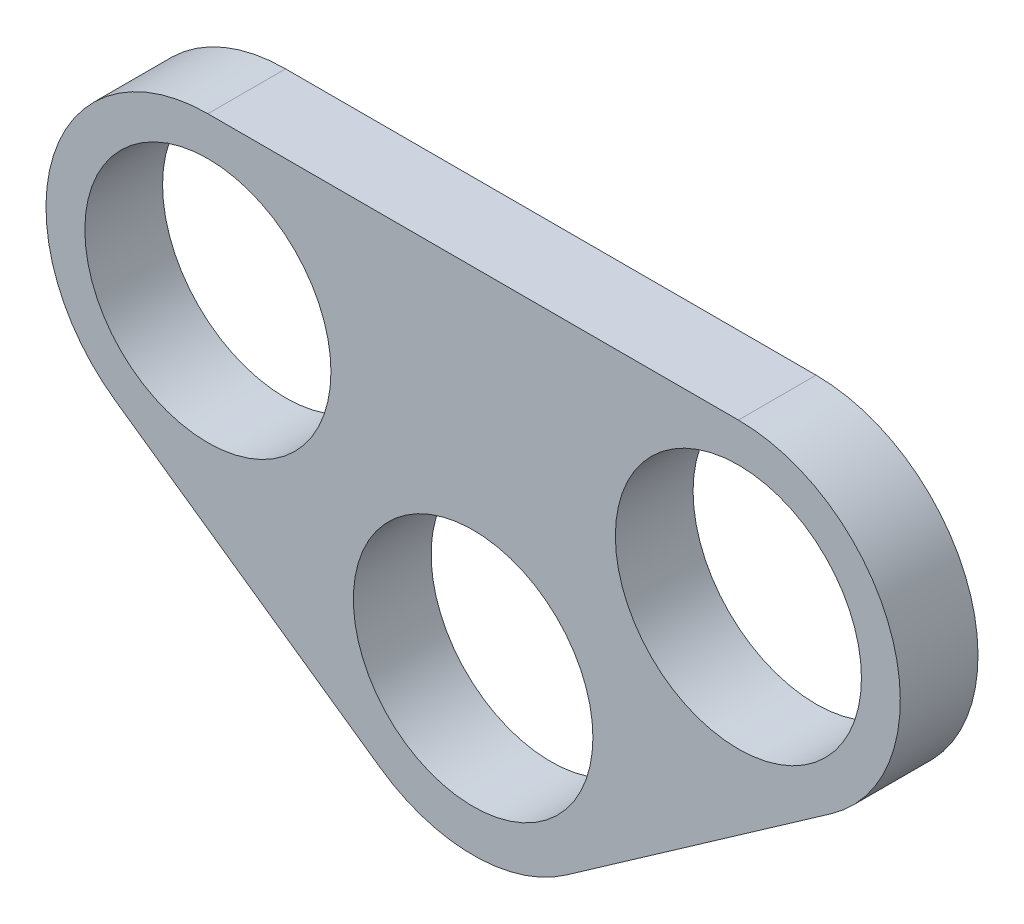
ISO-10303-21;
HEADER;
FILE_DESCRIPTION(('STEP AP214'),'2;1');
FILE_NAME('part.step','',(''),(''),'','','');
FILE_SCHEMA(('AUTOMOTIVE_DESIGN { 1 0 10303 214 1 1 1 1 }'));
ENDSEC;
DATA;
#1=APPLICATION_CONTEXT('core data for automotive mechanical design processes');
#2=APPLICATION_PROTOCOL_DEFINITION('international standard','automotive_design',2000,#1);
#3=PRODUCT_CONTEXT('',#1,'mechanical');
#4=PRODUCT('Part','Part','',(#3));
#5=PRODUCT_RELATED_PRODUCT_CATEGORY('part','',(#4));
#6=PRODUCT_DEFINITION_FORMATION('','',#4);
#7=PRODUCT_DEFINITION_CONTEXT('part definition',#1,'design');
#8=PRODUCT_DEFINITION('design','',#6,#7);
#9=PRODUCT_DEFINITION_SHAPE('','',#8);
#10=(LENGTH_UNIT() NAMED_UNIT(*) SI_UNIT(.MILLI.,.METRE.));
#11=(NAMED_UNIT(*) PLANE_ANGLE_UNIT() SI_UNIT($,.RADIAN.));
#12=(NAMED_UNIT(*) SI_UNIT($,.STERADIAN.) SOLID_ANGLE_UNIT());
#13=UNCERTAINTY_MEASURE_WITH_UNIT(LENGTH_MEASURE(1.E-05),#10,'distance_accuracy_value','');
#14=(GEOMETRIC_REPRESENTATION_CONTEXT(3) GLOBAL_UNCERTAINTY_ASSIGNED_CONTEXT((#13)) GLOBAL_UNIT_ASSIGNED_CONTEXT((#10,
#11,#12)) REPRESENTATION_CONTEXT('',''));
#15=CARTESIAN_POINT('',(0.,0.,0.));
#16=DIRECTION('',(0.,0.,1.));
#17=DIRECTION('',(1.,0.,0.));
#18=AXIS2_PLACEMENT_3D('',#15,#16,#17);
#19=CARTESIAN_POINT('',(7.16970545438809,-10.2394005536124,6.));
#20=DIRECTION('',(-0.573576436351047,0.819152044288991,0.));
#21=DIRECTION('',(-0.819152044288991,-0.573576436351047,0.));
#22=AXIS2_PLACEMENT_3D('',#19,#20,#21);
#23=PLANE('',#22);
#24=DIRECTION('',(0.819152044288991,0.573576436351047,0.));
#25=VECTOR('',#24,1.);
#26=CARTESIAN_POINT('',(7.16970545438809,-10.2394005536124,0.));
#27=LINE('',#26,#25);
#28=CARTESIAN_POINT('',(7.16970545438809,-10.2394005536124,0.));
#29=VERTEX_POINT('',#28);
#30=CARTESIAN_POINT('',(27.6485065616129,4.10001035516379,0.));
#31=VERTEX_POINT('',#30);
#32=EDGE_CURVE('E128',#29,#31,#27,.T.);
#33=ORIENTED_EDGE('',*,*,#32,.T.);
#34=DIRECTION('',(0.,0.,-1.));
#35=VECTOR('',#34,1.);
#36=CARTESIAN_POINT('',(27.6485065616129,4.10001035516379,6.));
#37=LINE('',#36,#35);
#38=CARTESIAN_POINT('',(27.6485065616129,4.10001035516379,6.));
#39=VERTEX_POINT('',#38);
#40=EDGE_CURVE('E11',#39,#31,#37,.T.);
#41=ORIENTED_EDGE('',*,*,#40,.F.);
#42=DIRECTION('',(0.819152044288991,0.573576436351047,0.));
#43=VECTOR('',#42,1.);
#44=CARTESIAN_POINT('',(7.16970545438809,-10.2394005536124,6.));
#45=LINE('',#44,#43);
#46=CARTESIAN_POINT('',(7.16970545438809,-10.2394005536124,6.));
#47=VERTEX_POINT('',#46);
#48=EDGE_CURVE('E149',#47,#39,#45,.T.);
#49=ORIENTED_EDGE('',*,*,#48,.F.);
#50=DIRECTION('',(0.,0.,-1.));
#51=VECTOR('',#50,1.);
#52=CARTESIAN_POINT('',(7.16970545438809,-10.2394005536124,6.));
#53=LINE('',#52,#51);
#54=EDGE_CURVE('E127',#47,#29,#53,.T.);
#55=ORIENTED_EDGE('',*,*,#54,.T.);
#56=EDGE_LOOP('',(#33,#41,#49,#55));
#57=FACE_BOUND('',#56,.T.);
#58=ADVANCED_FACE('F35',(#57),#23,.F.);
#59=CARTESIAN_POINT('',(20.4788011072248,14.3394109087762,6.));
#60=DIRECTION('',(0.,0.,-1.));
#61=DIRECTION('',(-1.,0.,0.));
#62=AXIS2_PLACEMENT_3D('',#59,#60,#61);
#63=CYLINDRICAL_SURFACE('',#62,12.5);
#64=CARTESIAN_POINT('',(20.4788011072248,14.3394109087762,0.));
#65=DIRECTION('',(0.,0.,1.));
#66=DIRECTION('',(1.,0.,0.));
#67=AXIS2_PLACEMENT_3D('',#64,#65,#66);
#68=CIRCLE('',#67,12.5);
#69=CARTESIAN_POINT('',(20.4788011072248,26.8394109087762,0.));
#70=VERTEX_POINT('',#69);
#71=EDGE_CURVE('E131',#31,#70,#68,.T.);
#72=ORIENTED_EDGE('',*,*,#71,.T.);
#73=DIRECTION('',(0.,0.,-1.));
#74=VECTOR('',#73,1.);
#75=CARTESIAN_POINT('',(20.4788011072248,26.8394109087762,6.));
#76=LINE('',#75,#74);
#77=CARTESIAN_POINT('',(20.4788011072248,26.8394109087762,6.));
#78=VERTEX_POINT('',#77);
#79=EDGE_CURVE('E43',#78,#70,#76,.T.);
#80=ORIENTED_EDGE('',*,*,#79,.F.);
#81=CARTESIAN_POINT('',(20.4788011072248,14.3394109087762,6.));
#82=DIRECTION('',(0.,0.,1.));
#83=DIRECTION('',(1.,0.,0.));
#84=AXIS2_PLACEMENT_3D('',#81,#82,#83);
#85=CIRCLE('',#84,12.5);
#86=EDGE_CURVE('E88',#39,#78,#85,.T.);
#87=ORIENTED_EDGE('',*,*,#86,.F.);
#88=ORIENTED_EDGE('',*,*,#40,.T.);
#89=EDGE_LOOP('',(#72,#80,#87,#88));
#90=FACE_BOUND('',#89,.T.);
#91=ADVANCED_FACE('F155',(#90),#63,.T.);
#92=CARTESIAN_POINT('',(0.,26.8394109087761,6.));
#93=DIRECTION('',(0.,1.,0.));
#94=DIRECTION('',(-1.,0.,0.));
#95=AXIS2_PLACEMENT_3D('',#92,#93,#94);
#96=PLANE('',#95);
#97=DIRECTION('',(1.,0.,0.));
#98=VECTOR('',#97,1.);
#99=CARTESIAN_POINT('',(0.,26.8394109087761,0.));
#100=LINE('',#99,#98);
#101=CARTESIAN_POINT('',(-20.4788011072249,26.839410908776,0.));
#102=VERTEX_POINT('',#101);
#103=EDGE_CURVE('E134',#102,#70,#100,.T.);
#104=ORIENTED_EDGE('',*,*,#103,.F.);
#105=DIRECTION('',(0.,0.,-1.));
#106=VECTOR('',#105,1.);
#107=CARTESIAN_POINT('',(-20.4788011072249,26.839410908776,6.));
#108=LINE('',#107,#106);
#109=CARTESIAN_POINT('',(-20.4788011072249,26.839410908776,6.));
#110=VERTEX_POINT('',#109);
#111=EDGE_CURVE('E110',#110,#102,#108,.T.);
#112=ORIENTED_EDGE('',*,*,#111,.F.);
#113=DIRECTION('',(1.,0.,0.));
#114=VECTOR('',#113,1.);
#115=CARTESIAN_POINT('',(0.,26.8394109087761,6.));
#116=LINE('',#115,#114);
#117=EDGE_CURVE('E103',#110,#78,#116,.T.);
#118=ORIENTED_EDGE('',*,*,#117,.T.);
#119=ORIENTED_EDGE('',*,*,#79,.T.);
#120=EDGE_LOOP('',(#104,#112,#118,#119));
#121=FACE_BOUND('',#120,.T.);
#122=ADVANCED_FACE('F154',(#121),#96,.T.);
#123=CARTESIAN_POINT('',(-20.4788011072249,14.339410908776,6.));
#124=DIRECTION('',(0.,0.,-1.));
#125=DIRECTION('',(-1.,0.,0.));
#126=AXIS2_PLACEMENT_3D('',#123,#124,#125);
#127=CYLINDRICAL_SURFACE('',#126,12.5);
#128=CARTESIAN_POINT('',(-20.4788011072249,14.339410908776,0.));
#129=DIRECTION('',(0.,0.,1.));
#130=DIRECTION('',(1.,0.,0.));
#131=AXIS2_PLACEMENT_3D('',#128,#129,#130);
#132=CIRCLE('',#131,12.5);
#133=CARTESIAN_POINT('',(-27.6485065616129,4.1000103551636,0.));
#134=VERTEX_POINT('',#133);
#135=EDGE_CURVE('E109',#102,#134,#132,.T.);
#136=ORIENTED_EDGE('',*,*,#135,.T.);
#137=DIRECTION('',(0.,0.,-1.));
#138=VECTOR('',#137,1.);
#139=CARTESIAN_POINT('',(-27.6485065616129,4.1000103551636,6.));
#140=LINE('',#139,#138);
#141=CARTESIAN_POINT('',(-27.6485065616129,4.1000103551636,6.));
#142=VERTEX_POINT('',#141);
#143=EDGE_CURVE('E106',#142,#134,#140,.T.);
#144=ORIENTED_EDGE('',*,*,#143,.F.);
#145=CARTESIAN_POINT('',(-20.4788011072249,14.339410908776,6.));
#146=DIRECTION('',(0.,0.,1.));
#147=DIRECTION('',(1.,0.,0.));
#148=AXIS2_PLACEMENT_3D('',#145,#146,#147);
#149=CIRCLE('',#148,12.5);
#150=EDGE_CURVE('E96',#110,#142,#149,.T.);
#151=ORIENTED_EDGE('',*,*,#150,.F.);
#152=ORIENTED_EDGE('',*,*,#111,.T.);
#153=EDGE_LOOP('',(#136,#144,#151,#152));
#154=FACE_BOUND('',#153,.T.);
#155=ADVANCED_FACE('F107',(#154),#127,.T.);
#156=CARTESIAN_POINT('',(-7.16970545438802,-10.2394005536124,6.));
#157=DIRECTION('',(0.573576436351042,0.819152044288995,0.));
#158=DIRECTION('',(-0.819152044288995,0.573576436351042,0.));
#159=AXIS2_PLACEMENT_3D('',#156,#157,#158);
#160=PLANE('',#159);
#161=DIRECTION('',(0.819152044288995,-0.573576436351042,0.));
#162=VECTOR('',#161,1.);
#163=CARTESIAN_POINT('',(-7.16970545438802,-10.2394005536124,0.));
#164=LINE('',#163,#162);
#165=CARTESIAN_POINT('',(-7.16970545438802,-10.2394005536124,0.));
#166=VERTEX_POINT('',#165);
#167=EDGE_CURVE('E74',#134,#166,#164,.T.);
#168=ORIENTED_EDGE('',*,*,#167,.T.);
#169=DIRECTION('',(0.,0.,-1.));
#170=VECTOR('',#169,1.);
#171=CARTESIAN_POINT('',(-7.16970545438802,-10.2394005536124,6.));
#172=LINE('',#171,#170);
#173=CARTESIAN_POINT('',(-7.16970545438802,-10.2394005536124,6.));
#174=VERTEX_POINT('',#173);
#175=EDGE_CURVE('E111',#174,#166,#172,.T.);
#176=ORIENTED_EDGE('',*,*,#175,.F.);
#177=DIRECTION('',(0.819152044288995,-0.573576436351042,0.));
#178=VECTOR('',#177,1.);
#179=CARTESIAN_POINT('',(-7.16970545438802,-10.2394005536124,6.));
#180=LINE('',#179,#178);
#181=EDGE_CURVE('E101',#142,#174,#180,.T.);
#182=ORIENTED_EDGE('',*,*,#181,.F.);
#183=ORIENTED_EDGE('',*,*,#143,.T.);
#184=EDGE_LOOP('',(#168,#176,#182,#183));
#185=FACE_BOUND('',#184,.T.);
#186=ADVANCED_FACE('F113',(#185),#160,.F.);
#187=CARTESIAN_POINT('',(-20.4788011072249,14.339410908776,6.));
#188=DIRECTION('',(0.,0.,-1.));
#189=DIRECTION('',(-1.,0.,0.));
#190=AXIS2_PLACEMENT_3D('',#187,#188,#189);
#191=CYLINDRICAL_SURFACE('',#190,9.5);
#192=CARTESIAN_POINT('',(-20.4788011072249,14.339410908776,6.));
#193=DIRECTION('',(0.,0.,1.));
#194=DIRECTION('',(1.,0.,0.));
#195=AXIS2_PLACEMENT_3D('',#192,#193,#194);
#196=CIRCLE('',#195,9.5);
#197=CARTESIAN_POINT('',(-10.9788011072249,14.339410908776,6.));
#198=VERTEX_POINT('',#197);
#199=EDGE_CURVE('E121',#198,#198,#196,.T.);
#200=ORIENTED_EDGE('',*,*,#199,.T.);
#201=EDGE_LOOP('',(#200));
#202=FACE_BOUND('',#201,.T.);
#203=CARTESIAN_POINT('',(-20.4788011072249,14.339410908776,0.));
#204=DIRECTION('',(0.,0.,1.));
#205=DIRECTION('',(1.,0.,0.));
#206=AXIS2_PLACEMENT_3D('',#203,#204,#205);
#207=CIRCLE('',#206,9.5);
#208=CARTESIAN_POINT('',(-10.9788011072249,14.339410908776,0.));
#209=VERTEX_POINT('',#208);
#210=EDGE_CURVE('E143',#209,#209,#207,.T.);
#211=ORIENTED_EDGE('',*,*,#210,.F.);
#212=EDGE_LOOP('',(#211));
#213=FACE_BOUND('',#212,.T.);
#214=ADVANCED_FACE('F174',(#202,#213),#191,.F.);
#215=CARTESIAN_POINT('',(0.,0.,6.));
#216=DIRECTION('',(0.,0.,-1.));
#217=DIRECTION('',(-1.,0.,0.));
#218=AXIS2_PLACEMENT_3D('',#215,#216,#217);
#219=CYLINDRICAL_SURFACE('',#218,9.24776843538257);
#220=CARTESIAN_POINT('',(0.,0.,6.));
#221=DIRECTION('',(0.,0.,1.));
#222=DIRECTION('',(1.,0.,0.));
#223=AXIS2_PLACEMENT_3D('',#220,#221,#222);
#224=CIRCLE('',#223,9.24776843538257);
#225=CARTESIAN_POINT('',(9.24776843538257,0.,6.));
#226=VERTEX_POINT('',#225);
#227=EDGE_CURVE('E115',#226,#226,#224,.T.);
#228=ORIENTED_EDGE('',*,*,#227,.T.);
#229=EDGE_LOOP('',(#228));
#230=FACE_BOUND('',#229,.T.);
#231=CARTESIAN_POINT('',(0.,0.,0.));
#232=DIRECTION('',(0.,0.,1.));
#233=DIRECTION('',(1.,0.,0.));
#234=AXIS2_PLACEMENT_3D('',#231,#232,#233);
#235=CIRCLE('',#234,9.24776843538257);
#236=CARTESIAN_POINT('',(9.24776843538257,0.,0.));
#237=VERTEX_POINT('',#236);
#238=EDGE_CURVE('E140',#237,#237,#235,.T.);
#239=ORIENTED_EDGE('',*,*,#238,.F.);
#240=EDGE_LOOP('',(#239));
#241=FACE_BOUND('',#240,.T.);
#242=ADVANCED_FACE('F166',(#230,#241),#219,.F.);
#243=CARTESIAN_POINT('',(0.,0.,6.));
#244=DIRECTION('',(0.,0.,-1.));
#245=DIRECTION('',(-1.,0.,0.));
#246=AXIS2_PLACEMENT_3D('',#243,#244,#245);
#247=CYLINDRICAL_SURFACE('',#246,12.5);
#248=CARTESIAN_POINT('',(0.,0.,0.));
#249=DIRECTION('',(0.,0.,1.));
#250=DIRECTION('',(1.,0.,0.));
#251=AXIS2_PLACEMENT_3D('',#248,#249,#250);
#252=CIRCLE('',#251,12.5);
#253=EDGE_CURVE('E80',#166,#29,#252,.T.);
#254=ORIENTED_EDGE('',*,*,#253,.T.);
#255=ORIENTED_EDGE('',*,*,#54,.F.);
#256=CARTESIAN_POINT('',(0.,0.,6.));
#257=DIRECTION('',(0.,0.,1.));
#258=DIRECTION('',(1.,0.,0.));
#259=AXIS2_PLACEMENT_3D('',#256,#257,#258);
#260=CIRCLE('',#259,12.5);
#261=EDGE_CURVE('E51',#174,#47,#260,.T.);
#262=ORIENTED_EDGE('',*,*,#261,.F.);
#263=ORIENTED_EDGE('',*,*,#175,.T.);
#264=EDGE_LOOP('',(#254,#255,#262,#263));
#265=FACE_BOUND('',#264,.T.);
#266=ADVANCED_FACE('F163',(#265),#247,.T.);
#267=CARTESIAN_POINT('',(20.4788011072248,14.3394109087762,6.));
#268=DIRECTION('',(0.,0.,-1.));
#269=DIRECTION('',(-1.,0.,0.));
#270=AXIS2_PLACEMENT_3D('',#267,#268,#269);
#271=CYLINDRICAL_SURFACE('',#270,9.5);
#272=CARTESIAN_POINT('',(20.4788011072248,14.3394109087762,6.));
#273=DIRECTION('',(0.,0.,1.));
#274=DIRECTION('',(1.,0.,0.));
#275=AXIS2_PLACEMENT_3D('',#272,#273,#274);
#276=CIRCLE('',#275,9.5);
#277=CARTESIAN_POINT('',(29.9788011072248,14.3394109087762,6.));
#278=VERTEX_POINT('',#277);
#279=EDGE_CURVE('E124',#278,#278,#276,.T.);
#280=ORIENTED_EDGE('',*,*,#279,.T.);
#281=EDGE_LOOP('',(#280));
#282=FACE_BOUND('',#281,.T.);
#283=CARTESIAN_POINT('',(20.4788011072248,14.3394109087762,0.));
#284=DIRECTION('',(0.,0.,1.));
#285=DIRECTION('',(1.,0.,0.));
#286=AXIS2_PLACEMENT_3D('',#283,#284,#285);
#287=CIRCLE('',#286,9.5);
#288=CARTESIAN_POINT('',(29.9788011072248,14.3394109087762,0.));
#289=VERTEX_POINT('',#288);
#290=EDGE_CURVE('E146',#289,#289,#287,.T.);
#291=ORIENTED_EDGE('',*,*,#290,.F.);
#292=EDGE_LOOP('',(#291));
#293=FACE_BOUND('',#292,.T.);
#294=ADVANCED_FACE('F165',(#282,#293),#271,.F.);
#295=CARTESIAN_POINT('',(0.,0.,6.));
#296=DIRECTION('',(0.,0.,1.));
#297=DIRECTION('',(1.,0.,0.));
#298=AXIS2_PLACEMENT_3D('',#295,#296,#297);
#299=PLANE('',#298);
#300=ORIENTED_EDGE('',*,*,#48,.T.);
#301=ORIENTED_EDGE('',*,*,#86,.T.);
#302=ORIENTED_EDGE('',*,*,#117,.F.);
#303=ORIENTED_EDGE('',*,*,#150,.T.);
#304=ORIENTED_EDGE('',*,*,#181,.T.);
#305=ORIENTED_EDGE('',*,*,#261,.T.);
#306=EDGE_LOOP('',(#300,#301,#302,#303,#304,#305));
#307=FACE_BOUND('',#306,.T.);
#308=ORIENTED_EDGE('',*,*,#227,.F.);
#309=EDGE_LOOP('',(#308));
#310=FACE_BOUND('',#309,.T.);
#311=ORIENTED_EDGE('',*,*,#199,.F.);
#312=EDGE_LOOP('',(#311));
#313=FACE_BOUND('',#312,.T.);
#314=ORIENTED_EDGE('',*,*,#279,.F.);
#315=EDGE_LOOP('',(#314));
#316=FACE_BOUND('',#315,.T.);
#317=ADVANCED_FACE('F98',(#307,#310,#313,#316),#299,.T.);
#318=CARTESIAN_POINT('',(0.,0.,0.));
#319=DIRECTION('',(0.,0.,1.));
#320=DIRECTION('',(1.,0.,0.));
#321=AXIS2_PLACEMENT_3D('',#318,#319,#320);
#322=PLANE('',#321);
#323=ORIENTED_EDGE('',*,*,#32,.F.);
#324=ORIENTED_EDGE('',*,*,#253,.F.);
#325=ORIENTED_EDGE('',*,*,#167,.F.);
#326=ORIENTED_EDGE('',*,*,#135,.F.);
#327=ORIENTED_EDGE('',*,*,#103,.T.);
#328=ORIENTED_EDGE('',*,*,#71,.F.);
#329=EDGE_LOOP('',(#323,#324,#325,#326,#327,#328));
#330=FACE_BOUND('',#329,.T.);
#331=ORIENTED_EDGE('',*,*,#238,.T.);
#332=EDGE_LOOP('',(#331));
#333=FACE_BOUND('',#332,.T.);
#334=ORIENTED_EDGE('',*,*,#210,.T.);
#335=EDGE_LOOP('',(#334));
#336=FACE_BOUND('',#335,.T.);
#337=ORIENTED_EDGE('',*,*,#290,.T.);
#338=EDGE_LOOP('',(#337));
#339=FACE_BOUND('',#338,.T.);
#340=ADVANCED_FACE('F159',(#330,#333,#336,#339),#322,.F.);
#341=CLOSED_SHELL('',(#58,#91,#122,#155,#186,#214,#242,#266,#294,#317,#340));
#342=MANIFOLD_SOLID_BREP('B2',#341);
#343=ADVANCED_BREP_SHAPE_REPRESENTATION('',(#18,#342),#14);
#344=SHAPE_DEFINITION_REPRESENTATION(#9,#343);
ENDSEC;
END-ISO-10303-21;
